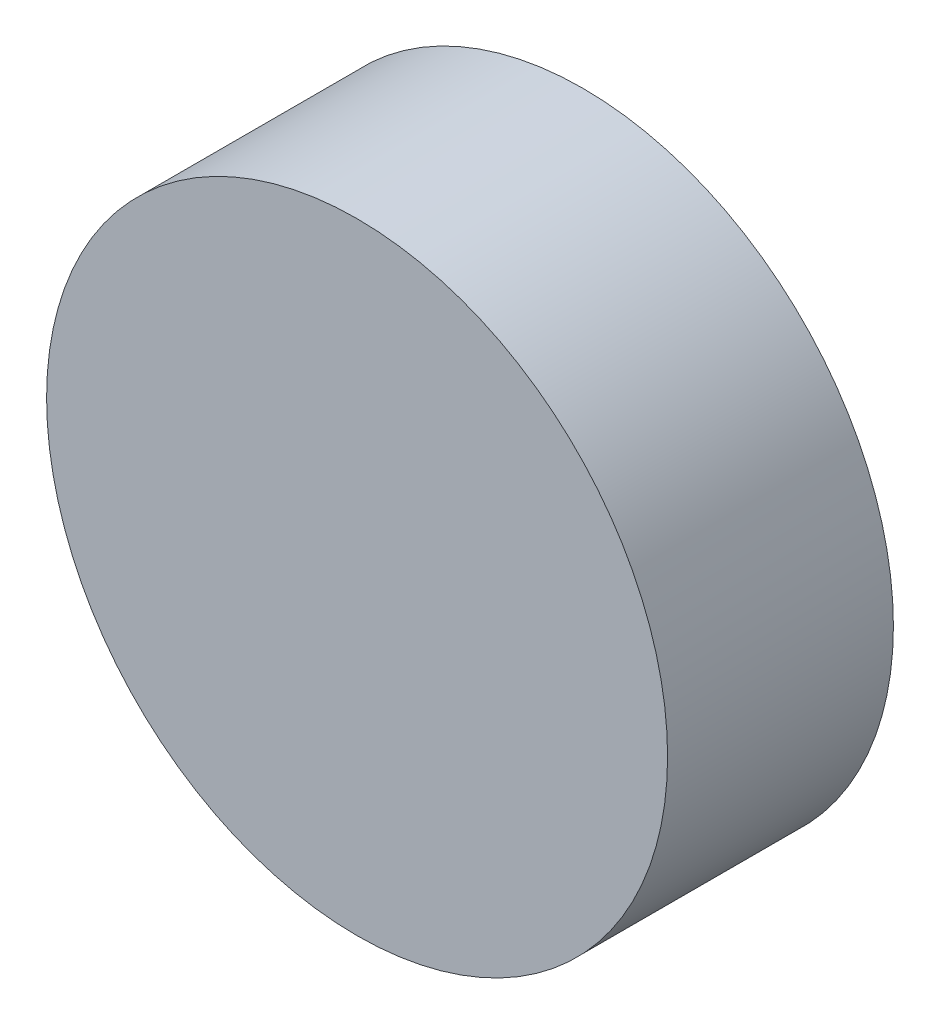
ISO-10303-21;
HEADER;
FILE_DESCRIPTION(('STEP AP214'),'2;1');
FILE_NAME('part.step','',(''),(''),'','','');
FILE_SCHEMA(('AUTOMOTIVE_DESIGN { 1 0 10303 214 1 1 1 1 }'));
ENDSEC;
DATA;
#1=APPLICATION_CONTEXT('core data for automotive mechanical design processes');
#2=APPLICATION_PROTOCOL_DEFINITION('international standard','automotive_design',2000,#1);
#3=PRODUCT_CONTEXT('',#1,'mechanical');
#4=PRODUCT('Part','Part','',(#3));
#5=PRODUCT_RELATED_PRODUCT_CATEGORY('part','',(#4));
#6=PRODUCT_DEFINITION_FORMATION('','',#4);
#7=PRODUCT_DEFINITION_CONTEXT('part definition',#1,'design');
#8=PRODUCT_DEFINITION('design','',#6,#7);
#9=PRODUCT_DEFINITION_SHAPE('','',#8);
#10=(LENGTH_UNIT() NAMED_UNIT(*) SI_UNIT(.MILLI.,.METRE.));
#11=(NAMED_UNIT(*) PLANE_ANGLE_UNIT() SI_UNIT($,.RADIAN.));
#12=(NAMED_UNIT(*) SI_UNIT($,.STERADIAN.) SOLID_ANGLE_UNIT());
#13=UNCERTAINTY_MEASURE_WITH_UNIT(LENGTH_MEASURE(1.E-05),#10,'distance_accuracy_value','');
#14=(GEOMETRIC_REPRESENTATION_CONTEXT(3) GLOBAL_UNCERTAINTY_ASSIGNED_CONTEXT((#13)) GLOBAL_UNIT_ASSIGNED_CONTEXT((#10,
#11,#12)) REPRESENTATION_CONTEXT('',''));
#15=CARTESIAN_POINT('',(0.,0.,0.));
#16=DIRECTION('',(0.,0.,1.));
#17=DIRECTION('',(1.,0.,0.));
#18=AXIS2_PLACEMENT_3D('',#15,#16,#17);
#19=CARTESIAN_POINT('',(0.,0.,40.));
#20=DIRECTION('',(0.,0.,-1.));
#21=DIRECTION('',(-1.,0.,0.));
#22=AXIS2_PLACEMENT_3D('',#19,#20,#21);
#23=CYLINDRICAL_SURFACE('',#22,55.);
#24=CARTESIAN_POINT('',(0.,0.,40.));
#25=DIRECTION('',(0.,0.,1.));
#26=DIRECTION('',(1.,0.,0.));
#27=AXIS2_PLACEMENT_3D('',#24,#25,#26);
#28=CIRCLE('',#27,55.);
#29=CARTESIAN_POINT('',(55.,0.,40.));
#30=VERTEX_POINT('',#29);
#31=EDGE_CURVE('E10',#30,#30,#28,.T.);
#32=ORIENTED_EDGE('',*,*,#31,.F.);
#33=EDGE_LOOP('',(#32));
#34=FACE_BOUND('',#33,.T.);
#35=CARTESIAN_POINT('',(0.,0.,0.));
#36=DIRECTION('',(0.,0.,1.));
#37=DIRECTION('',(1.,0.,0.));
#38=AXIS2_PLACEMENT_3D('',#35,#36,#37);
#39=CIRCLE('',#38,55.);
#40=CARTESIAN_POINT('',(55.,0.,0.));
#41=VERTEX_POINT('',#40);
#42=EDGE_CURVE('E38',#41,#41,#39,.T.);
#43=ORIENTED_EDGE('',*,*,#42,.T.);
#44=EDGE_LOOP('',(#43));
#45=FACE_BOUND('',#44,.T.);
#46=ADVANCED_FACE('F35',(#34,#45),#23,.T.);
#47=CARTESIAN_POINT('',(0.,0.,40.));
#48=DIRECTION('',(0.,0.,1.));
#49=DIRECTION('',(1.,0.,0.));
#50=AXIS2_PLACEMENT_3D('',#47,#48,#49);
#51=PLANE('',#50);
#52=ORIENTED_EDGE('',*,*,#31,.T.);
#53=EDGE_LOOP('',(#52));
#54=FACE_BOUND('',#53,.T.);
#55=ADVANCED_FACE('F64',(#54),#51,.T.);
#56=CARTESIAN_POINT('',(0.,0.,0.));
#57=DIRECTION('',(0.,0.,1.));
#58=DIRECTION('',(1.,0.,0.));
#59=AXIS2_PLACEMENT_3D('',#56,#57,#58);
#60=PLANE('',#59);
#61=CARTESIAN_POINT('',(0.,0.,0.));
#62=DIRECTION('',(0.,0.,-1.));
#63=DIRECTION('',(-1.,0.,0.));
#64=AXIS2_PLACEMENT_3D('',#61,#62,#63);
#65=CIRCLE('',#64,25.);
#66=CARTESIAN_POINT('',(-25.,0.,0.));
#67=VERTEX_POINT('',#66);
#68=EDGE_CURVE('E47',#67,#67,#65,.T.);
#69=ORIENTED_EDGE('',*,*,#68,.F.);
#70=EDGE_LOOP('',(#69));
#71=FACE_BOUND('',#70,.T.);
#72=ORIENTED_EDGE('',*,*,#42,.F.);
#73=EDGE_LOOP('',(#72));
#74=FACE_BOUND('',#73,.T.);
#75=ADVANCED_FACE('F58',(#71,#74),#60,.F.);
#76=CARTESIAN_POINT('',(0.,0.,20.));
#77=DIRECTION('',(0.,0.,-1.));
#78=DIRECTION('',(-1.,0.,0.));
#79=AXIS2_PLACEMENT_3D('',#76,#77,#78);
#80=CYLINDRICAL_SURFACE('',#79,25.);
#81=CARTESIAN_POINT('',(0.,0.,20.));
#82=DIRECTION('',(0.,0.,-1.));
#83=DIRECTION('',(-1.,0.,0.));
#84=AXIS2_PLACEMENT_3D('',#81,#82,#83);
#85=CIRCLE('',#84,25.);
#86=CARTESIAN_POINT('',(-25.,0.,20.));
#87=VERTEX_POINT('',#86);
#88=EDGE_CURVE('E45',#87,#87,#85,.T.);
#89=ORIENTED_EDGE('',*,*,#88,.F.);
#90=EDGE_LOOP('',(#89));
#91=FACE_BOUND('',#90,.T.);
#92=ORIENTED_EDGE('',*,*,#68,.T.);
#93=EDGE_LOOP('',(#92));
#94=FACE_BOUND('',#93,.T.);
#95=ADVANCED_FACE('F55',(#91,#94),#80,.F.);
#96=CARTESIAN_POINT('',(0.,0.,20.));
#97=DIRECTION('',(0.,0.,-1.));
#98=DIRECTION('',(-1.,0.,0.));
#99=AXIS2_PLACEMENT_3D('',#96,#97,#98);
#100=PLANE('',#99);
#101=ORIENTED_EDGE('',*,*,#88,.T.);
#102=EDGE_LOOP('',(#101));
#103=FACE_BOUND('',#102,.T.);
#104=ADVANCED_FACE('F53',(#103),#100,.T.);
#105=CLOSED_SHELL('',(#46,#55,#75,#95,#104));
#106=MANIFOLD_SOLID_BREP('B2',#105);
#107=ADVANCED_BREP_SHAPE_REPRESENTATION('',(#18,#106),#14);
#108=SHAPE_DEFINITION_REPRESENTATION(#9,#107);
ENDSEC;
END-ISO-10303-21;
